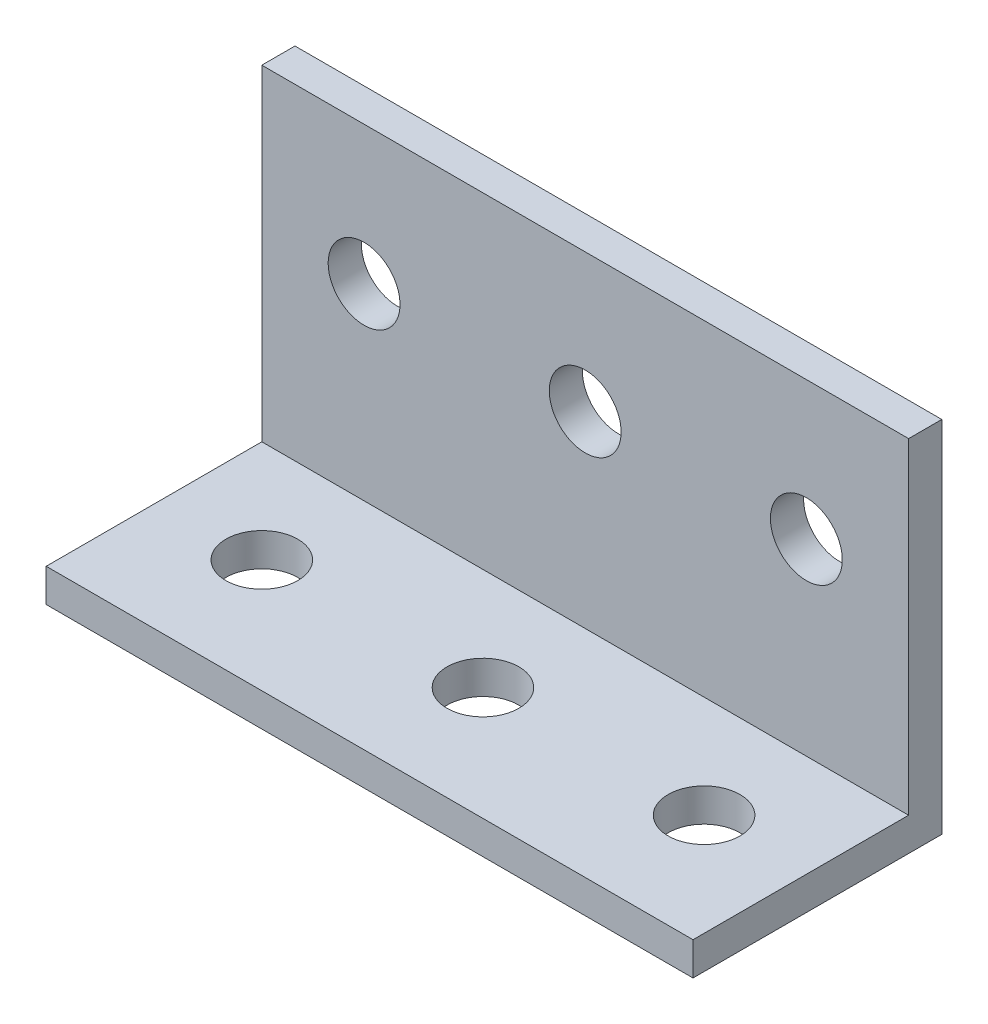
ISO-10303-21;
HEADER;
FILE_DESCRIPTION(('STEP AP214'),'2;1');
FILE_NAME('part.step','',(''),(''),'','','');
FILE_SCHEMA(('AUTOMOTIVE_DESIGN { 1 0 10303 214 1 1 1 1 }'));
ENDSEC;
DATA;
#1=APPLICATION_CONTEXT('core data for automotive mechanical design processes');
#2=APPLICATION_PROTOCOL_DEFINITION('international standard','automotive_design',2000,#1);
#3=PRODUCT_CONTEXT('',#1,'mechanical');
#4=PRODUCT('Part','Part','',(#3));
#5=PRODUCT_RELATED_PRODUCT_CATEGORY('part','',(#4));
#6=PRODUCT_DEFINITION_FORMATION('','',#4);
#7=PRODUCT_DEFINITION_CONTEXT('part definition',#1,'design');
#8=PRODUCT_DEFINITION('design','',#6,#7);
#9=PRODUCT_DEFINITION_SHAPE('','',#8);
#10=(LENGTH_UNIT() NAMED_UNIT(*) SI_UNIT(.MILLI.,.METRE.));
#11=(NAMED_UNIT(*) PLANE_ANGLE_UNIT() SI_UNIT($,.RADIAN.));
#12=(NAMED_UNIT(*) SI_UNIT($,.STERADIAN.) SOLID_ANGLE_UNIT());
#13=UNCERTAINTY_MEASURE_WITH_UNIT(LENGTH_MEASURE(1.E-05),#10,'distance_accuracy_value','');
#14=(GEOMETRIC_REPRESENTATION_CONTEXT(3) GLOBAL_UNCERTAINTY_ASSIGNED_CONTEXT((#13)) GLOBAL_UNIT_ASSIGNED_CONTEXT((#10,
#11,#12)) REPRESENTATION_CONTEXT('',''));
#15=CARTESIAN_POINT('',(0.,0.,0.));
#16=DIRECTION('',(0.,0.,1.));
#17=DIRECTION('',(1.,0.,0.));
#18=AXIS2_PLACEMENT_3D('',#15,#16,#17);
#19=CARTESIAN_POINT('',(0.,0.,90.));
#20=DIRECTION('',(1.,0.,0.));
#21=DIRECTION('',(0.,1.,0.));
#22=AXIS2_PLACEMENT_3D('',#19,#20,#21);
#23=PLANE('',#22);
#24=DIRECTION('',(0.,-1.,0.));
#25=VECTOR('',#24,1.);
#26=CARTESIAN_POINT('',(0.,0.,90.));
#27=LINE('',#26,#25);
#28=CARTESIAN_POINT('',(0.,12.,90.));
#29=VERTEX_POINT('',#28);
#30=CARTESIAN_POINT('',(0.,0.,90.));
#31=VERTEX_POINT('',#30);
#32=EDGE_CURVE('E99',#29,#31,#27,.T.);
#33=ORIENTED_EDGE('',*,*,#32,.F.);
#34=DIRECTION('',(0.,0.,1.));
#35=VECTOR('',#34,1.);
#36=CARTESIAN_POINT('',(0.,12.,90.));
#37=LINE('',#36,#35);
#38=CARTESIAN_POINT('',(0.,12.,12.));
#39=VERTEX_POINT('',#38);
#40=EDGE_CURVE('E49',#39,#29,#37,.T.);
#41=ORIENTED_EDGE('',*,*,#40,.F.);
#42=DIRECTION('',(0.,-1.,0.));
#43=VECTOR('',#42,1.);
#44=CARTESIAN_POINT('',(0.,130.,12.));
#45=LINE('',#44,#43);
#46=CARTESIAN_POINT('',(0.,130.,12.));
#47=VERTEX_POINT('',#46);
#48=EDGE_CURVE('E86',#47,#39,#45,.T.);
#49=ORIENTED_EDGE('',*,*,#48,.F.);
#50=DIRECTION('',(0.,0.,-1.));
#51=VECTOR('',#50,1.);
#52=CARTESIAN_POINT('',(0.,130.,90.));
#53=LINE('',#52,#51);
#54=CARTESIAN_POINT('',(0.,130.,0.));
#55=VERTEX_POINT('',#54);
#56=EDGE_CURVE('E78',#47,#55,#53,.T.);
#57=ORIENTED_EDGE('',*,*,#56,.T.);
#58=DIRECTION('',(0.,-1.,0.));
#59=VECTOR('',#58,1.);
#60=CARTESIAN_POINT('',(0.,0.,0.));
#61=LINE('',#60,#59);
#62=CARTESIAN_POINT('',(0.,0.,0.));
#63=VERTEX_POINT('',#62);
#64=EDGE_CURVE('E83',#55,#63,#61,.T.);
#65=ORIENTED_EDGE('',*,*,#64,.T.);
#66=DIRECTION('',(0.,0.,-1.));
#67=VECTOR('',#66,1.);
#68=CARTESIAN_POINT('',(0.,0.,90.));
#69=LINE('',#68,#67);
#70=EDGE_CURVE('E119',#31,#63,#69,.T.);
#71=ORIENTED_EDGE('',*,*,#70,.F.);
#72=EDGE_LOOP('',(#33,#41,#49,#57,#65,#71));
#73=FACE_BOUND('',#72,.T.);
#74=ADVANCED_FACE('F34',(#73),#23,.F.);
#75=CARTESIAN_POINT('',(0.,0.,90.));
#76=DIRECTION('',(0.,1.,0.));
#77=DIRECTION('',(0.,0.,1.));
#78=AXIS2_PLACEMENT_3D('',#75,#76,#77);
#79=PLANE('',#78);
#80=CARTESIAN_POINT('',(117.,0.,49.));
#81=DIRECTION('',(0.,-1.,0.));
#82=DIRECTION('',(0.,0.,-1.));
#83=AXIS2_PLACEMENT_3D('',#80,#81,#82);
#84=CIRCLE('',#83,13.);
#85=CARTESIAN_POINT('',(117.,0.,36.));
#86=VERTEX_POINT('',#85);
#87=EDGE_CURVE('E262',#86,#86,#84,.T.);
#88=ORIENTED_EDGE('',*,*,#87,.F.);
#89=EDGE_LOOP('',(#88));
#90=FACE_BOUND('',#89,.T.);
#91=CARTESIAN_POINT('',(37.,0.,49.));
#92=DIRECTION('',(0.,-1.,0.));
#93=DIRECTION('',(0.,0.,-1.));
#94=AXIS2_PLACEMENT_3D('',#91,#92,#93);
#95=CIRCLE('',#94,13.);
#96=CARTESIAN_POINT('',(37.,0.,36.));
#97=VERTEX_POINT('',#96);
#98=EDGE_CURVE('E134',#97,#97,#95,.T.);
#99=ORIENTED_EDGE('',*,*,#98,.F.);
#100=EDGE_LOOP('',(#99));
#101=FACE_BOUND('',#100,.T.);
#102=DIRECTION('',(1.,0.,0.));
#103=VECTOR('',#102,1.);
#104=CARTESIAN_POINT('',(0.,0.,0.));
#105=LINE('',#104,#103);
#106=CARTESIAN_POINT('',(234.,0.,0.));
#107=VERTEX_POINT('',#106);
#108=EDGE_CURVE('E104',#63,#107,#105,.T.);
#109=ORIENTED_EDGE('',*,*,#108,.T.);
#110=DIRECTION('',(0.,0.,-1.));
#111=VECTOR('',#110,1.);
#112=CARTESIAN_POINT('',(234.,0.,90.));
#113=LINE('',#112,#111);
#114=CARTESIAN_POINT('',(234.,0.,90.));
#115=VERTEX_POINT('',#114);
#116=EDGE_CURVE('E116',#115,#107,#113,.T.);
#117=ORIENTED_EDGE('',*,*,#116,.F.);
#118=DIRECTION('',(1.,0.,0.));
#119=VECTOR('',#118,1.);
#120=CARTESIAN_POINT('',(0.,0.,90.));
#121=LINE('',#120,#119);
#122=EDGE_CURVE('E58',#31,#115,#121,.T.);
#123=ORIENTED_EDGE('',*,*,#122,.F.);
#124=ORIENTED_EDGE('',*,*,#70,.T.);
#125=EDGE_LOOP('',(#109,#117,#123,#124));
#126=FACE_BOUND('',#125,.T.);
#127=CARTESIAN_POINT('',(197.,0.,49.));
#128=DIRECTION('',(0.,-1.,0.));
#129=DIRECTION('',(0.,0.,-1.));
#130=AXIS2_PLACEMENT_3D('',#127,#128,#129);
#131=CIRCLE('',#130,13.);
#132=CARTESIAN_POINT('',(197.,0.,36.));
#133=VERTEX_POINT('',#132);
#134=EDGE_CURVE('E42',#133,#133,#131,.T.);
#135=ORIENTED_EDGE('',*,*,#134,.F.);
#136=EDGE_LOOP('',(#135));
#137=FACE_BOUND('',#136,.T.);
#138=ADVANCED_FACE('F140',(#90,#101,#126,#137),#79,.F.);
#139=CARTESIAN_POINT('',(234.,0.,90.));
#140=DIRECTION('',(-1.,0.,0.));
#141=DIRECTION('',(0.,-1.,0.));
#142=AXIS2_PLACEMENT_3D('',#139,#140,#141);
#143=PLANE('',#142);
#144=DIRECTION('',(0.,-1.,0.));
#145=VECTOR('',#144,1.);
#146=CARTESIAN_POINT('',(234.,130.,12.));
#147=LINE('',#146,#145);
#148=CARTESIAN_POINT('',(234.,130.,12.));
#149=VERTEX_POINT('',#148);
#150=CARTESIAN_POINT('',(234.,12.0000000000001,12.));
#151=VERTEX_POINT('',#150);
#152=EDGE_CURVE('E277',#149,#151,#147,.T.);
#153=ORIENTED_EDGE('',*,*,#152,.T.);
#154=DIRECTION('',(0.,0.,1.));
#155=VECTOR('',#154,1.);
#156=CARTESIAN_POINT('',(234.,12.0000000000001,90.));
#157=LINE('',#156,#155);
#158=CARTESIAN_POINT('',(234.,12.0000000000001,90.));
#159=VERTEX_POINT('',#158);
#160=EDGE_CURVE('E280',#151,#159,#157,.T.);
#161=ORIENTED_EDGE('',*,*,#160,.T.);
#162=DIRECTION('',(0.,1.,0.));
#163=VECTOR('',#162,1.);
#164=CARTESIAN_POINT('',(234.,0.,90.));
#165=LINE('',#164,#163);
#166=EDGE_CURVE('E90',#115,#159,#165,.T.);
#167=ORIENTED_EDGE('',*,*,#166,.F.);
#168=ORIENTED_EDGE('',*,*,#116,.T.);
#169=DIRECTION('',(0.,1.,0.));
#170=VECTOR('',#169,1.);
#171=CARTESIAN_POINT('',(234.,0.,0.));
#172=LINE('',#171,#170);
#173=CARTESIAN_POINT('',(234.,130.,0.));
#174=VERTEX_POINT('',#173);
#175=EDGE_CURVE('E100',#107,#174,#172,.T.);
#176=ORIENTED_EDGE('',*,*,#175,.T.);
#177=DIRECTION('',(0.,0.,-1.));
#178=VECTOR('',#177,1.);
#179=CARTESIAN_POINT('',(234.,130.,90.));
#180=LINE('',#179,#178);
#181=EDGE_CURVE('E89',#149,#174,#180,.T.);
#182=ORIENTED_EDGE('',*,*,#181,.F.);
#183=EDGE_LOOP('',(#153,#161,#167,#168,#176,#182));
#184=FACE_BOUND('',#183,.T.);
#185=ADVANCED_FACE('F142',(#184),#143,.F.);
#186=CARTESIAN_POINT('',(0.,130.,90.));
#187=DIRECTION('',(0.,-1.,0.));
#188=DIRECTION('',(0.,0.,-1.));
#189=AXIS2_PLACEMENT_3D('',#186,#187,#188);
#190=PLANE('',#189);
#191=ORIENTED_EDGE('',*,*,#56,.F.);
#192=DIRECTION('',(-1.,0.,0.));
#193=VECTOR('',#192,1.);
#194=CARTESIAN_POINT('',(234.,130.,12.));
#195=LINE('',#194,#193);
#196=EDGE_CURVE('E283',#149,#47,#195,.T.);
#197=ORIENTED_EDGE('',*,*,#196,.F.);
#198=ORIENTED_EDGE('',*,*,#181,.T.);
#199=DIRECTION('',(-1.,0.,0.));
#200=VECTOR('',#199,1.);
#201=CARTESIAN_POINT('',(0.,130.,0.));
#202=LINE('',#201,#200);
#203=EDGE_CURVE('E93',#174,#55,#202,.T.);
#204=ORIENTED_EDGE('',*,*,#203,.T.);
#205=EDGE_LOOP('',(#191,#197,#198,#204));
#206=FACE_BOUND('',#205,.T.);
#207=ADVANCED_FACE('F94',(#206),#190,.F.);
#208=CARTESIAN_POINT('',(0.,0.,90.));
#209=DIRECTION('',(0.,0.,-1.));
#210=DIRECTION('',(-1.,0.,0.));
#211=AXIS2_PLACEMENT_3D('',#208,#209,#210);
#212=PLANE('',#211);
#213=ORIENTED_EDGE('',*,*,#166,.T.);
#214=DIRECTION('',(-1.,0.,0.));
#215=VECTOR('',#214,1.);
#216=CARTESIAN_POINT('',(234.,12.0000000000001,90.));
#217=LINE('',#216,#215);
#218=EDGE_CURVE('E106',#159,#29,#217,.T.);
#219=ORIENTED_EDGE('',*,*,#218,.T.);
#220=ORIENTED_EDGE('',*,*,#32,.T.);
#221=ORIENTED_EDGE('',*,*,#122,.T.);
#222=EDGE_LOOP('',(#213,#219,#220,#221));
#223=FACE_BOUND('',#222,.T.);
#224=ADVANCED_FACE('F190',(#223),#212,.F.);
#225=CARTESIAN_POINT('',(0.,0.,0.));
#226=DIRECTION('',(0.,0.,-1.));
#227=DIRECTION('',(-1.,0.,0.));
#228=AXIS2_PLACEMENT_3D('',#225,#226,#227);
#229=PLANE('',#228);
#230=CARTESIAN_POINT('',(117.,80.,0.));
#231=DIRECTION('',(0.,0.,-1.));
#232=DIRECTION('',(-1.,0.,0.));
#233=AXIS2_PLACEMENT_3D('',#230,#231,#232);
#234=CIRCLE('',#233,13.);
#235=CARTESIAN_POINT('',(104.,80.,0.));
#236=VERTEX_POINT('',#235);
#237=EDGE_CURVE('E133',#236,#236,#234,.T.);
#238=ORIENTED_EDGE('',*,*,#237,.F.);
#239=EDGE_LOOP('',(#238));
#240=FACE_BOUND('',#239,.T.);
#241=CARTESIAN_POINT('',(197.,80.,0.));
#242=DIRECTION('',(0.,0.,-1.));
#243=DIRECTION('',(-1.,0.,0.));
#244=AXIS2_PLACEMENT_3D('',#241,#242,#243);
#245=CIRCLE('',#244,13.);
#246=CARTESIAN_POINT('',(184.,80.,0.));
#247=VERTEX_POINT('',#246);
#248=EDGE_CURVE('E125',#247,#247,#245,.T.);
#249=ORIENTED_EDGE('',*,*,#248,.F.);
#250=EDGE_LOOP('',(#249));
#251=FACE_BOUND('',#250,.T.);
#252=ORIENTED_EDGE('',*,*,#64,.F.);
#253=ORIENTED_EDGE('',*,*,#203,.F.);
#254=ORIENTED_EDGE('',*,*,#175,.F.);
#255=ORIENTED_EDGE('',*,*,#108,.F.);
#256=EDGE_LOOP('',(#252,#253,#254,#255));
#257=FACE_BOUND('',#256,.T.);
#258=CARTESIAN_POINT('',(37.,80.,0.));
#259=DIRECTION('',(0.,0.,-1.));
#260=DIRECTION('',(-1.,0.,0.));
#261=AXIS2_PLACEMENT_3D('',#258,#259,#260);
#262=CIRCLE('',#261,13.);
#263=CARTESIAN_POINT('',(24.,80.,0.));
#264=VERTEX_POINT('',#263);
#265=EDGE_CURVE('E121',#264,#264,#262,.T.);
#266=ORIENTED_EDGE('',*,*,#265,.F.);
#267=EDGE_LOOP('',(#266));
#268=FACE_BOUND('',#267,.T.);
#269=ADVANCED_FACE('F102',(#240,#251,#257,#268),#229,.T.);
#270=CARTESIAN_POINT('',(234.,12.0000000000001,90.));
#271=DIRECTION('',(0.,-1.,0.));
#272=DIRECTION('',(1.,0.,0.));
#273=AXIS2_PLACEMENT_3D('',#270,#271,#272);
#274=PLANE('',#273);
#275=CARTESIAN_POINT('',(117.,12.,49.));
#276=DIRECTION('',(0.,-1.,0.));
#277=DIRECTION('',(1.,0.,0.));
#278=AXIS2_PLACEMENT_3D('',#275,#276,#277);
#279=CIRCLE('',#278,13.);
#280=CARTESIAN_POINT('',(130.,12.,49.));
#281=VERTEX_POINT('',#280);
#282=EDGE_CURVE('E265',#281,#281,#279,.T.);
#283=ORIENTED_EDGE('',*,*,#282,.T.);
#284=EDGE_LOOP('',(#283));
#285=FACE_BOUND('',#284,.T.);
#286=CARTESIAN_POINT('',(37.,12.,49.));
#287=DIRECTION('',(0.,-1.,0.));
#288=DIRECTION('',(1.,0.,0.));
#289=AXIS2_PLACEMENT_3D('',#286,#287,#288);
#290=CIRCLE('',#289,13.);
#291=CARTESIAN_POINT('',(50.,12.,49.));
#292=VERTEX_POINT('',#291);
#293=EDGE_CURVE('E131',#292,#292,#290,.T.);
#294=ORIENTED_EDGE('',*,*,#293,.T.);
#295=EDGE_LOOP('',(#294));
#296=FACE_BOUND('',#295,.T.);
#297=ORIENTED_EDGE('',*,*,#40,.T.);
#298=ORIENTED_EDGE('',*,*,#218,.F.);
#299=ORIENTED_EDGE('',*,*,#160,.F.);
#300=DIRECTION('',(-1.,0.,0.));
#301=VECTOR('',#300,1.);
#302=CARTESIAN_POINT('',(234.,12.0000000000001,12.));
#303=LINE('',#302,#301);
#304=EDGE_CURVE('E109',#151,#39,#303,.T.);
#305=ORIENTED_EDGE('',*,*,#304,.T.);
#306=EDGE_LOOP('',(#297,#298,#299,#305));
#307=FACE_BOUND('',#306,.T.);
#308=CARTESIAN_POINT('',(197.,12.,49.));
#309=DIRECTION('',(0.,-1.,0.));
#310=DIRECTION('',(1.,0.,0.));
#311=AXIS2_PLACEMENT_3D('',#308,#309,#310);
#312=CIRCLE('',#311,13.);
#313=CARTESIAN_POINT('',(210.,12.,49.));
#314=VERTEX_POINT('',#313);
#315=EDGE_CURVE('E11',#314,#314,#312,.T.);
#316=ORIENTED_EDGE('',*,*,#315,.T.);
#317=EDGE_LOOP('',(#316));
#318=FACE_BOUND('',#317,.T.);
#319=ADVANCED_FACE('F176',(#285,#296,#307,#318),#274,.F.);
#320=CARTESIAN_POINT('',(234.,130.,12.));
#321=DIRECTION('',(0.,0.,-1.));
#322=DIRECTION('',(0.,1.,0.));
#323=AXIS2_PLACEMENT_3D('',#320,#321,#322);
#324=PLANE('',#323);
#325=CARTESIAN_POINT('',(117.,80.,12.));
#326=DIRECTION('',(0.,0.,-1.));
#327=DIRECTION('',(0.,1.,0.));
#328=AXIS2_PLACEMENT_3D('',#325,#326,#327);
#329=CIRCLE('',#328,13.);
#330=CARTESIAN_POINT('',(104.,80.,12.));
#331=VERTEX_POINT('',#330);
#332=EDGE_CURVE('E273',#331,#331,#329,.T.);
#333=ORIENTED_EDGE('',*,*,#332,.T.);
#334=EDGE_LOOP('',(#333));
#335=FACE_BOUND('',#334,.T.);
#336=CARTESIAN_POINT('',(197.,80.,12.));
#337=DIRECTION('',(0.,0.,-1.));
#338=DIRECTION('',(0.,1.,0.));
#339=AXIS2_PLACEMENT_3D('',#336,#337,#338);
#340=CIRCLE('',#339,13.);
#341=CARTESIAN_POINT('',(184.,80.,12.));
#342=VERTEX_POINT('',#341);
#343=EDGE_CURVE('E122',#342,#342,#340,.T.);
#344=ORIENTED_EDGE('',*,*,#343,.T.);
#345=EDGE_LOOP('',(#344));
#346=FACE_BOUND('',#345,.T.);
#347=ORIENTED_EDGE('',*,*,#48,.T.);
#348=ORIENTED_EDGE('',*,*,#304,.F.);
#349=ORIENTED_EDGE('',*,*,#152,.F.);
#350=ORIENTED_EDGE('',*,*,#196,.T.);
#351=EDGE_LOOP('',(#347,#348,#349,#350));
#352=FACE_BOUND('',#351,.T.);
#353=CARTESIAN_POINT('',(37.,80.,12.));
#354=DIRECTION('',(0.,0.,-1.));
#355=DIRECTION('',(0.,1.,0.));
#356=AXIS2_PLACEMENT_3D('',#353,#354,#355);
#357=CIRCLE('',#356,13.);
#358=CARTESIAN_POINT('',(24.,80.,12.));
#359=VERTEX_POINT('',#358);
#360=EDGE_CURVE('E128',#359,#359,#357,.T.);
#361=ORIENTED_EDGE('',*,*,#360,.T.);
#362=EDGE_LOOP('',(#361));
#363=FACE_BOUND('',#362,.T.);
#364=ADVANCED_FACE('F174',(#335,#346,#352,#363),#324,.F.);
#365=CARTESIAN_POINT('',(197.,80.,90.));
#366=DIRECTION('',(0.,0.,-1.));
#367=DIRECTION('',(-1.,0.,0.));
#368=AXIS2_PLACEMENT_3D('',#365,#366,#367);
#369=CYLINDRICAL_SURFACE('',#368,13.);
#370=CARTESIAN_POINT('',(184.,80.,0.));
#371=CARTESIAN_POINT('',(184.,80.,0.125));
#372=CARTESIAN_POINT('',(184.,80.,0.25));
#373=CARTESIAN_POINT('',(184.,80.,0.5));
#374=CARTESIAN_POINT('',(184.,80.,0.625000000000001));
#375=CARTESIAN_POINT('',(184.,80.,0.875000000000001));
#376=CARTESIAN_POINT('',(184.,80.,1.));
#377=CARTESIAN_POINT('',(184.,80.,1.25));
#378=CARTESIAN_POINT('',(184.,80.,1.375));
#379=CARTESIAN_POINT('',(184.,80.,1.625));
#380=CARTESIAN_POINT('',(184.,80.,1.75));
#381=CARTESIAN_POINT('',(184.,80.,2.));
#382=CARTESIAN_POINT('',(184.,80.,2.125));
#383=CARTESIAN_POINT('',(184.,80.,2.375));
#384=CARTESIAN_POINT('',(184.,80.,2.5));
#385=CARTESIAN_POINT('',(184.,80.,2.75));
#386=CARTESIAN_POINT('',(184.,80.,2.875));
#387=CARTESIAN_POINT('',(184.,80.,3.125));
#388=CARTESIAN_POINT('',(184.,80.,3.24999999999999));
#389=CARTESIAN_POINT('',(184.,80.,3.49999999999999));
#390=CARTESIAN_POINT('',(184.,80.,3.62499999999999));
#391=CARTESIAN_POINT('',(184.,80.,3.87499999999999));
#392=CARTESIAN_POINT('',(184.,80.,3.99999999999999));
#393=CARTESIAN_POINT('',(184.,80.,4.24999999999999));
#394=CARTESIAN_POINT('',(184.,80.,4.37499999999999));
#395=CARTESIAN_POINT('',(184.,80.,4.62499999999999));
#396=CARTESIAN_POINT('',(184.,80.,4.74999999999999));
#397=CARTESIAN_POINT('',(184.,80.,4.99999999999999));
#398=CARTESIAN_POINT('',(184.,80.,5.12499999999999));
#399=CARTESIAN_POINT('',(184.,80.,5.37499999999999));
#400=CARTESIAN_POINT('',(184.,80.,5.49999999999999));
#401=CARTESIAN_POINT('',(184.,80.,5.74999999999999));
#402=CARTESIAN_POINT('',(184.,80.,5.87499999999999));
#403=CARTESIAN_POINT('',(184.,80.,6.12499999999999));
#404=CARTESIAN_POINT('',(184.,80.,6.24999999999999));
#405=CARTESIAN_POINT('',(184.,80.,6.49999999999999));
#406=CARTESIAN_POINT('',(184.,80.,6.62499999999999));
#407=CARTESIAN_POINT('',(184.,80.,6.87499999999999));
#408=CARTESIAN_POINT('',(184.,80.,6.99999999999999));
#409=CARTESIAN_POINT('',(184.,80.,7.24999999999999));
#410=CARTESIAN_POINT('',(184.,80.,7.37499999999999));
#411=CARTESIAN_POINT('',(184.,80.,7.62499999999999));
#412=CARTESIAN_POINT('',(184.,80.,7.74999999999999));
#413=CARTESIAN_POINT('',(184.,80.,7.99999999999999));
#414=CARTESIAN_POINT('',(184.,80.,8.12499999999999));
#415=CARTESIAN_POINT('',(184.,80.,8.37499999999999));
#416=CARTESIAN_POINT('',(184.,80.,8.49999999999999));
#417=CARTESIAN_POINT('',(184.,80.,8.74999999999999));
#418=CARTESIAN_POINT('',(184.,80.,8.87499999999999));
#419=CARTESIAN_POINT('',(184.,80.,9.12499999999999));
#420=CARTESIAN_POINT('',(184.,80.,9.24999999999999));
#421=CARTESIAN_POINT('',(184.,80.,9.49999999999999));
#422=CARTESIAN_POINT('',(184.,80.,9.62499999999999));
#423=CARTESIAN_POINT('',(184.,80.,9.87499999999998));
#424=CARTESIAN_POINT('',(184.,80.,9.99999999999998));
#425=CARTESIAN_POINT('',(184.,80.,10.25));
#426=CARTESIAN_POINT('',(184.,80.,10.375));
#427=CARTESIAN_POINT('',(184.,80.,10.625));
#428=CARTESIAN_POINT('',(184.,80.,10.75));
#429=CARTESIAN_POINT('',(184.,80.,11.));
#430=CARTESIAN_POINT('',(184.,80.,11.125));
#431=CARTESIAN_POINT('',(184.,80.,11.375));
#432=CARTESIAN_POINT('',(184.,80.,11.5));
#433=CARTESIAN_POINT('',(184.,80.,11.75));
#434=CARTESIAN_POINT('',(184.,80.,11.875));
#435=CARTESIAN_POINT('',(184.,80.,12.));
#436=B_SPLINE_CURVE_WITH_KNOTS('',3,(#370,#371,#372,#373,#374,#375,#376,#377,#378,#379,#380,
#381,#382,#383,#384,#385,#386,#387,#388,#389,#390,#391,#392,#393,#394,#395,#396,#397,#398,#399,
#400,#401,#402,#403,#404,#405,#406,#407,#408,#409,#410,#411,#412,#413,#414,#415,#416,#417,#418,
#419,#420,#421,#422,#423,#424,#425,#426,#427,#428,#429,#430,#431,#432,#433,#434,#435),
.UNSPECIFIED.,.F.,.F.,(4,2,2,2,2,2,2,2,2,2,2,2,2,2,2,2,2,2,2,2,2,2,2,2,2,2,2,2,2,2,2,2,4),(0.,
0.375,0.750000000000001,1.125,1.5,1.875,2.25,2.625,3.,3.37499999999999,3.74999999999999,
4.12499999999999,4.49999999999999,4.87499999999999,5.24999999999999,5.62499999999999,
5.99999999999999,6.37499999999999,6.74999999999999,7.12499999999999,7.49999999999999,
7.87499999999999,8.24999999999999,8.62499999999999,8.99999999999998,9.37499999999999,
9.74999999999998,10.125,10.5,10.875,11.25,11.625,12.),.UNSPECIFIED.);
#437=EDGE_CURVE('BSEAM167',#247,#342,#436,.T.);
#438=ORIENTED_EDGE('',*,*,#248,.T.);
#439=ORIENTED_EDGE('',*,*,#343,.F.);
#440=ORIENTED_EDGE('',*,*,#437,.T.);
#441=ORIENTED_EDGE('',*,*,#437,.F.);
#442=EDGE_LOOP('',(#438,#440,#439,#441));
#443=FACE_BOUND('',#442,.T.);
#444=ADVANCED_FACE('F167',(#443),#369,.F.);
#445=CARTESIAN_POINT('',(117.,80.,90.));
#446=DIRECTION('',(0.,0.,-1.));
#447=DIRECTION('',(-1.,0.,0.));
#448=AXIS2_PLACEMENT_3D('',#445,#446,#447);
#449=CYLINDRICAL_SURFACE('',#448,13.);
#450=CARTESIAN_POINT('',(104.,80.,0.));
#451=CARTESIAN_POINT('',(104.,80.,0.125));
#452=CARTESIAN_POINT('',(104.,80.,0.25));
#453=CARTESIAN_POINT('',(104.,80.,0.5));
#454=CARTESIAN_POINT('',(104.,80.,0.625000000000001));
#455=CARTESIAN_POINT('',(104.,80.,0.875000000000001));
#456=CARTESIAN_POINT('',(104.,80.,1.));
#457=CARTESIAN_POINT('',(104.,80.,1.25));
#458=CARTESIAN_POINT('',(104.,80.,1.375));
#459=CARTESIAN_POINT('',(104.,80.,1.625));
#460=CARTESIAN_POINT('',(104.,80.,1.75));
#461=CARTESIAN_POINT('',(104.,80.,2.));
#462=CARTESIAN_POINT('',(104.,80.,2.125));
#463=CARTESIAN_POINT('',(104.,80.,2.375));
#464=CARTESIAN_POINT('',(104.,80.,2.5));
#465=CARTESIAN_POINT('',(104.,80.,2.75));
#466=CARTESIAN_POINT('',(104.,80.,2.875));
#467=CARTESIAN_POINT('',(104.,80.,3.125));
#468=CARTESIAN_POINT('',(104.,80.,3.24999999999999));
#469=CARTESIAN_POINT('',(104.,80.,3.49999999999999));
#470=CARTESIAN_POINT('',(104.,80.,3.62499999999999));
#471=CARTESIAN_POINT('',(104.,80.,3.87499999999999));
#472=CARTESIAN_POINT('',(104.,80.,3.99999999999999));
#473=CARTESIAN_POINT('',(104.,80.,4.24999999999999));
#474=CARTESIAN_POINT('',(104.,80.,4.37499999999999));
#475=CARTESIAN_POINT('',(104.,80.,4.62499999999999));
#476=CARTESIAN_POINT('',(104.,80.,4.74999999999999));
#477=CARTESIAN_POINT('',(104.,80.,4.99999999999999));
#478=CARTESIAN_POINT('',(104.,80.,5.12499999999999));
#479=CARTESIAN_POINT('',(104.,80.,5.37499999999999));
#480=CARTESIAN_POINT('',(104.,80.,5.49999999999999));
#481=CARTESIAN_POINT('',(104.,80.,5.74999999999999));
#482=CARTESIAN_POINT('',(104.,80.,5.87499999999999));
#483=CARTESIAN_POINT('',(104.,80.,6.12499999999999));
#484=CARTESIAN_POINT('',(104.,80.,6.24999999999999));
#485=CARTESIAN_POINT('',(104.,80.,6.49999999999999));
#486=CARTESIAN_POINT('',(104.,80.,6.62499999999999));
#487=CARTESIAN_POINT('',(104.,80.,6.87499999999999));
#488=CARTESIAN_POINT('',(104.,80.,6.99999999999999));
#489=CARTESIAN_POINT('',(104.,80.,7.24999999999999));
#490=CARTESIAN_POINT('',(104.,80.,7.37499999999999));
#491=CARTESIAN_POINT('',(104.,80.,7.62499999999999));
#492=CARTESIAN_POINT('',(104.,80.,7.74999999999999));
#493=CARTESIAN_POINT('',(104.,80.,7.99999999999999));
#494=CARTESIAN_POINT('',(104.,80.,8.12499999999999));
#495=CARTESIAN_POINT('',(104.,80.,8.37499999999999));
#496=CARTESIAN_POINT('',(104.,80.,8.49999999999999));
#497=CARTESIAN_POINT('',(104.,80.,8.74999999999999));
#498=CARTESIAN_POINT('',(104.,80.,8.87499999999999));
#499=CARTESIAN_POINT('',(104.,80.,9.12499999999999));
#500=CARTESIAN_POINT('',(104.,80.,9.24999999999999));
#501=CARTESIAN_POINT('',(104.,80.,9.49999999999999));
#502=CARTESIAN_POINT('',(104.,80.,9.62499999999999));
#503=CARTESIAN_POINT('',(104.,80.,9.87499999999998));
#504=CARTESIAN_POINT('',(104.,80.,9.99999999999998));
#505=CARTESIAN_POINT('',(104.,80.,10.25));
#506=CARTESIAN_POINT('',(104.,80.,10.375));
#507=CARTESIAN_POINT('',(104.,80.,10.625));
#508=CARTESIAN_POINT('',(104.,80.,10.75));
#509=CARTESIAN_POINT('',(104.,80.,11.));
#510=CARTESIAN_POINT('',(104.,80.,11.125));
#511=CARTESIAN_POINT('',(104.,80.,11.375));
#512=CARTESIAN_POINT('',(104.,80.,11.5));
#513=CARTESIAN_POINT('',(104.,80.,11.75));
#514=CARTESIAN_POINT('',(104.,80.,11.875));
#515=CARTESIAN_POINT('',(104.,80.,12.));
#516=B_SPLINE_CURVE_WITH_KNOTS('',3,(#450,#451,#452,#453,#454,#455,#456,#457,#458,#459,#460,
#461,#462,#463,#464,#465,#466,#467,#468,#469,#470,#471,#472,#473,#474,#475,#476,#477,#478,#479,
#480,#481,#482,#483,#484,#485,#486,#487,#488,#489,#490,#491,#492,#493,#494,#495,#496,#497,#498,
#499,#500,#501,#502,#503,#504,#505,#506,#507,#508,#509,#510,#511,#512,#513,#514,#515),
.UNSPECIFIED.,.F.,.F.,(4,2,2,2,2,2,2,2,2,2,2,2,2,2,2,2,2,2,2,2,2,2,2,2,2,2,2,2,2,2,2,2,4),(0.,
0.375,0.750000000000001,1.125,1.5,1.875,2.25,2.625,3.,3.37499999999999,3.74999999999999,
4.12499999999999,4.49999999999999,4.87499999999999,5.24999999999999,5.62499999999999,
5.99999999999999,6.37499999999999,6.74999999999999,7.12499999999999,7.49999999999999,
7.87499999999999,8.24999999999999,8.62499999999999,8.99999999999998,9.37499999999999,
9.74999999999998,10.125,10.5,10.875,11.25,11.625,12.),.UNSPECIFIED.);
#517=EDGE_CURVE('BSEAM158',#236,#331,#516,.T.);
#518=ORIENTED_EDGE('',*,*,#237,.T.);
#519=ORIENTED_EDGE('',*,*,#332,.F.);
#520=ORIENTED_EDGE('',*,*,#517,.T.);
#521=ORIENTED_EDGE('',*,*,#517,.F.);
#522=EDGE_LOOP('',(#518,#520,#519,#521));
#523=FACE_BOUND('',#522,.T.);
#524=ADVANCED_FACE('F158',(#523),#449,.F.);
#525=CARTESIAN_POINT('',(37.,80.,90.));
#526=DIRECTION('',(0.,0.,-1.));
#527=DIRECTION('',(-1.,0.,0.));
#528=AXIS2_PLACEMENT_3D('',#525,#526,#527);
#529=CYLINDRICAL_SURFACE('',#528,13.);
#530=CARTESIAN_POINT('',(24.,80.,0.));
#531=CARTESIAN_POINT('',(24.,80.,0.125));
#532=CARTESIAN_POINT('',(24.,80.,0.25));
#533=CARTESIAN_POINT('',(24.,80.,0.5));
#534=CARTESIAN_POINT('',(24.,80.,0.625000000000001));
#535=CARTESIAN_POINT('',(24.,80.,0.875000000000001));
#536=CARTESIAN_POINT('',(24.,80.,1.));
#537=CARTESIAN_POINT('',(24.,80.,1.25));
#538=CARTESIAN_POINT('',(24.,80.,1.375));
#539=CARTESIAN_POINT('',(24.,80.,1.625));
#540=CARTESIAN_POINT('',(24.,80.,1.75));
#541=CARTESIAN_POINT('',(24.,80.,2.));
#542=CARTESIAN_POINT('',(24.,80.,2.125));
#543=CARTESIAN_POINT('',(24.,80.,2.375));
#544=CARTESIAN_POINT('',(24.,80.,2.5));
#545=CARTESIAN_POINT('',(24.,80.,2.75));
#546=CARTESIAN_POINT('',(24.,80.,2.875));
#547=CARTESIAN_POINT('',(24.,80.,3.125));
#548=CARTESIAN_POINT('',(24.,80.,3.24999999999999));
#549=CARTESIAN_POINT('',(24.,80.,3.49999999999999));
#550=CARTESIAN_POINT('',(24.,80.,3.62499999999999));
#551=CARTESIAN_POINT('',(24.,80.,3.87499999999999));
#552=CARTESIAN_POINT('',(24.,80.,3.99999999999999));
#553=CARTESIAN_POINT('',(24.,80.,4.24999999999999));
#554=CARTESIAN_POINT('',(24.,80.,4.37499999999999));
#555=CARTESIAN_POINT('',(24.,80.,4.62499999999999));
#556=CARTESIAN_POINT('',(24.,80.,4.74999999999999));
#557=CARTESIAN_POINT('',(24.,80.,4.99999999999999));
#558=CARTESIAN_POINT('',(24.,80.,5.12499999999999));
#559=CARTESIAN_POINT('',(24.,80.,5.37499999999999));
#560=CARTESIAN_POINT('',(24.,80.,5.49999999999999));
#561=CARTESIAN_POINT('',(24.,80.,5.74999999999999));
#562=CARTESIAN_POINT('',(24.,80.,5.87499999999999));
#563=CARTESIAN_POINT('',(24.,80.,6.12499999999999));
#564=CARTESIAN_POINT('',(24.,80.,6.24999999999999));
#565=CARTESIAN_POINT('',(24.,80.,6.49999999999999));
#566=CARTESIAN_POINT('',(24.,80.,6.62499999999999));
#567=CARTESIAN_POINT('',(24.,80.,6.87499999999999));
#568=CARTESIAN_POINT('',(24.,80.,6.99999999999999));
#569=CARTESIAN_POINT('',(24.,80.,7.24999999999999));
#570=CARTESIAN_POINT('',(24.,80.,7.37499999999999));
#571=CARTESIAN_POINT('',(24.,80.,7.62499999999999));
#572=CARTESIAN_POINT('',(24.,80.,7.74999999999999));
#573=CARTESIAN_POINT('',(24.,80.,7.99999999999999));
#574=CARTESIAN_POINT('',(24.,80.,8.12499999999999));
#575=CARTESIAN_POINT('',(24.,80.,8.37499999999999));
#576=CARTESIAN_POINT('',(24.,80.,8.49999999999999));
#577=CARTESIAN_POINT('',(24.,80.,8.74999999999999));
#578=CARTESIAN_POINT('',(24.,80.,8.87499999999999));
#579=CARTESIAN_POINT('',(24.,80.,9.12499999999999));
#580=CARTESIAN_POINT('',(24.,80.,9.24999999999999));
#581=CARTESIAN_POINT('',(24.,80.,9.49999999999999));
#582=CARTESIAN_POINT('',(24.,80.,9.62499999999999));
#583=CARTESIAN_POINT('',(24.,80.,9.87499999999998));
#584=CARTESIAN_POINT('',(24.,80.,9.99999999999998));
#585=CARTESIAN_POINT('',(24.,80.,10.25));
#586=CARTESIAN_POINT('',(24.,80.,10.375));
#587=CARTESIAN_POINT('',(24.,80.,10.625));
#588=CARTESIAN_POINT('',(24.,80.,10.75));
#589=CARTESIAN_POINT('',(24.,80.,11.));
#590=CARTESIAN_POINT('',(24.,80.,11.125));
#591=CARTESIAN_POINT('',(24.,80.,11.375));
#592=CARTESIAN_POINT('',(24.,80.,11.5));
#593=CARTESIAN_POINT('',(24.,80.,11.75));
#594=CARTESIAN_POINT('',(24.,80.,11.875));
#595=CARTESIAN_POINT('',(24.,80.,12.));
#596=B_SPLINE_CURVE_WITH_KNOTS('',3,(#530,#531,#532,#533,#534,#535,#536,#537,#538,#539,#540,
#541,#542,#543,#544,#545,#546,#547,#548,#549,#550,#551,#552,#553,#554,#555,#556,#557,#558,#559,
#560,#561,#562,#563,#564,#565,#566,#567,#568,#569,#570,#571,#572,#573,#574,#575,#576,#577,#578,
#579,#580,#581,#582,#583,#584,#585,#586,#587,#588,#589,#590,#591,#592,#593,#594,#595),
.UNSPECIFIED.,.F.,.F.,(4,2,2,2,2,2,2,2,2,2,2,2,2,2,2,2,2,2,2,2,2,2,2,2,2,2,2,2,2,2,2,2,4),(0.,
0.375,0.750000000000001,1.125,1.5,1.875,2.25,2.625,3.,3.37499999999999,3.74999999999999,
4.12499999999999,4.49999999999999,4.87499999999999,5.24999999999999,5.62499999999999,
5.99999999999999,6.37499999999999,6.74999999999999,7.12499999999999,7.49999999999999,
7.87499999999999,8.24999999999999,8.62499999999999,8.99999999999998,9.37499999999999,
9.74999999999998,10.125,10.5,10.875,11.25,11.625,12.),.UNSPECIFIED.);
#597=EDGE_CURVE('BSEAM155',#264,#359,#596,.T.);
#598=ORIENTED_EDGE('',*,*,#265,.T.);
#599=ORIENTED_EDGE('',*,*,#360,.F.);
#600=ORIENTED_EDGE('',*,*,#597,.T.);
#601=ORIENTED_EDGE('',*,*,#597,.F.);
#602=EDGE_LOOP('',(#598,#600,#599,#601));
#603=FACE_BOUND('',#602,.T.);
#604=ADVANCED_FACE('F155',(#603),#529,.F.);
#605=CARTESIAN_POINT('',(37.,130.,49.));
#606=DIRECTION('',(0.,-1.,0.));
#607=DIRECTION('',(0.,0.,-1.));
#608=AXIS2_PLACEMENT_3D('',#605,#606,#607);
#609=CYLINDRICAL_SURFACE('',#608,13.);
#610=ORIENTED_EDGE('',*,*,#98,.T.);
#611=EDGE_LOOP('',(#610));
#612=FACE_BOUND('',#611,.T.);
#613=ORIENTED_EDGE('',*,*,#293,.F.);
#614=EDGE_LOOP('',(#613));
#615=FACE_BOUND('',#614,.T.);
#616=ADVANCED_FACE('F157',(#612,#615),#609,.F.);
#617=CARTESIAN_POINT('',(117.,130.,49.));
#618=DIRECTION('',(0.,-1.,0.));
#619=DIRECTION('',(0.,0.,-1.));
#620=AXIS2_PLACEMENT_3D('',#617,#618,#619);
#621=CYLINDRICAL_SURFACE('',#620,13.);
#622=ORIENTED_EDGE('',*,*,#87,.T.);
#623=EDGE_LOOP('',(#622));
#624=FACE_BOUND('',#623,.T.);
#625=ORIENTED_EDGE('',*,*,#282,.F.);
#626=EDGE_LOOP('',(#625));
#627=FACE_BOUND('',#626,.T.);
#628=ADVANCED_FACE('F164',(#624,#627),#621,.F.);
#629=CARTESIAN_POINT('',(197.,130.,49.));
#630=DIRECTION('',(0.,-1.,0.));
#631=DIRECTION('',(0.,0.,-1.));
#632=AXIS2_PLACEMENT_3D('',#629,#630,#631);
#633=CYLINDRICAL_SURFACE('',#632,13.);
#634=ORIENTED_EDGE('',*,*,#134,.T.);
#635=EDGE_LOOP('',(#634));
#636=FACE_BOUND('',#635,.T.);
#637=ORIENTED_EDGE('',*,*,#315,.F.);
#638=EDGE_LOOP('',(#637));
#639=FACE_BOUND('',#638,.T.);
#640=ADVANCED_FACE('F36',(#636,#639),#633,.F.);
#641=CLOSED_SHELL('',(#74,#138,#185,#207,#224,#269,#319,#364,#444,#524,#604,#616,#628,#640));
#642=MANIFOLD_SOLID_BREP('B2',#641);
#643=ADVANCED_BREP_SHAPE_REPRESENTATION('',(#18,#642),#14);
#644=SHAPE_DEFINITION_REPRESENTATION(#9,#643);
ENDSEC;
END-ISO-10303-21;
